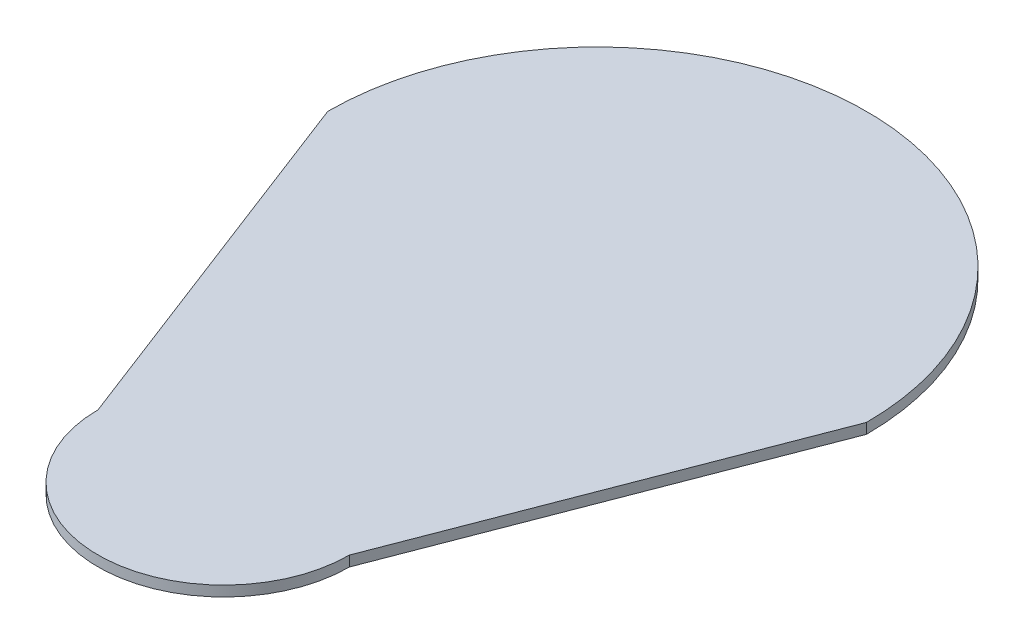
ISO-10303-21;
HEADER;
FILE_DESCRIPTION(('STEP AP214'),'2;1');
FILE_NAME('part.step','',(''),(''),'','','');
FILE_SCHEMA(('AUTOMOTIVE_DESIGN { 1 0 10303 214 1 1 1 1 }'));
ENDSEC;
DATA;
#1=APPLICATION_CONTEXT('core data for automotive mechanical design processes');
#2=APPLICATION_PROTOCOL_DEFINITION('international standard','automotive_design',2000,#1);
#3=PRODUCT_CONTEXT('',#1,'mechanical');
#4=PRODUCT('Part','Part','',(#3));
#5=PRODUCT_RELATED_PRODUCT_CATEGORY('part','',(#4));
#6=PRODUCT_DEFINITION_FORMATION('','',#4);
#7=PRODUCT_DEFINITION_CONTEXT('part definition',#1,'design');
#8=PRODUCT_DEFINITION('design','',#6,#7);
#9=PRODUCT_DEFINITION_SHAPE('','',#8);
#10=(LENGTH_UNIT() NAMED_UNIT(*) SI_UNIT(.MILLI.,.METRE.));
#11=(NAMED_UNIT(*) PLANE_ANGLE_UNIT() SI_UNIT($,.RADIAN.));
#12=(NAMED_UNIT(*) SI_UNIT($,.STERADIAN.) SOLID_ANGLE_UNIT());
#13=UNCERTAINTY_MEASURE_WITH_UNIT(LENGTH_MEASURE(1.E-05),#10,'distance_accuracy_value','');
#14=(GEOMETRIC_REPRESENTATION_CONTEXT(3) GLOBAL_UNCERTAINTY_ASSIGNED_CONTEXT((#13)) GLOBAL_UNIT_ASSIGNED_CONTEXT((#10,
#11,#12)) REPRESENTATION_CONTEXT('',''));
#15=CARTESIAN_POINT('',(0.,0.,0.));
#16=DIRECTION('',(0.,0.,1.));
#17=DIRECTION('',(1.,0.,0.));
#18=AXIS2_PLACEMENT_3D('',#15,#16,#17);
#19=CARTESIAN_POINT('',(0.,0.,0.));
#20=DIRECTION('',(0.,1.,0.));
#21=DIRECTION('',(0.,0.,1.));
#22=AXIS2_PLACEMENT_3D('',#19,#20,#21);
#23=PLANE('',#22);
#24=DIRECTION('',(0.359028119612366,0.,-0.933326743068904));
#25=VECTOR('',#24,1.);
#26=CARTESIAN_POINT('',(113.242845212589,0.,43.5617709212351));
#27=LINE('',#26,#25);
#28=CARTESIAN_POINT('',(60.6901829157269,0.,180.177268320401));
#29=VERTEX_POINT('',#28);
#30=CARTESIAN_POINT('',(130.,0.,0.));
#31=VERTEX_POINT('',#30);
#32=EDGE_CURVE('E113',#29,#31,#27,.T.);
#33=ORIENTED_EDGE('',*,*,#32,.F.);
#34=CARTESIAN_POINT('',(0.,0.,180.177268320401));
#35=DIRECTION('',(0.,1.,0.));
#36=DIRECTION('',(0.,0.,1.));
#37=AXIS2_PLACEMENT_3D('',#34,#35,#36);
#38=CIRCLE('',#37,60.6901829157268);
#39=CARTESIAN_POINT('',(-60.6901829157269,0.,180.177268320401));
#40=VERTEX_POINT('',#39);
#41=EDGE_CURVE('E125',#40,#29,#38,.T.);
#42=ORIENTED_EDGE('',*,*,#41,.F.);
#43=DIRECTION('',(-0.359028119612366,0.,-0.933326743068904));
#44=VECTOR('',#43,1.);
#45=CARTESIAN_POINT('',(-113.242845212589,0.,43.5617709212351));
#46=LINE('',#45,#44);
#47=CARTESIAN_POINT('',(-130.,0.,0.));
#48=VERTEX_POINT('',#47);
#49=EDGE_CURVE('E133',#40,#48,#46,.T.);
#50=ORIENTED_EDGE('',*,*,#49,.T.);
#51=CARTESIAN_POINT('',(0.,0.,0.));
#52=DIRECTION('',(0.,1.,0.));
#53=DIRECTION('',(0.,0.,1.));
#54=AXIS2_PLACEMENT_3D('',#51,#52,#53);
#55=CIRCLE('',#54,130.);
#56=EDGE_CURVE('E130',#31,#48,#55,.T.);
#57=ORIENTED_EDGE('',*,*,#56,.F.);
#58=EDGE_LOOP('',(#33,#42,#50,#57));
#59=FACE_BOUND('',#58,.T.);
#60=ADVANCED_FACE('F56',(#59),#23,.F.);
#61=CARTESIAN_POINT('',(0.,5.,180.177268320401));
#62=DIRECTION('',(0.,-1.,0.));
#63=DIRECTION('',(0.,0.,-1.));
#64=AXIS2_PLACEMENT_3D('',#61,#62,#63);
#65=CYLINDRICAL_SURFACE('',#64,60.6901829157268);
#66=ORIENTED_EDGE('',*,*,#41,.T.);
#67=DIRECTION('',(0.,-1.,0.));
#68=VECTOR('',#67,1.);
#69=CARTESIAN_POINT('',(60.6901829157269,5.,180.177268320401));
#70=LINE('',#69,#68);
#71=CARTESIAN_POINT('',(60.6901829157269,5.,180.177268320401));
#72=VERTEX_POINT('',#71);
#73=EDGE_CURVE('E12',#72,#29,#70,.T.);
#74=ORIENTED_EDGE('',*,*,#73,.F.);
#75=CARTESIAN_POINT('',(0.,5.,180.177268320401));
#76=DIRECTION('',(0.,1.,0.));
#77=DIRECTION('',(0.,0.,1.));
#78=AXIS2_PLACEMENT_3D('',#75,#76,#77);
#79=CIRCLE('',#78,60.6901829157268);
#80=CARTESIAN_POINT('',(-60.6901829157269,5.,180.177268320401));
#81=VERTEX_POINT('',#80);
#82=EDGE_CURVE('E106',#81,#72,#79,.T.);
#83=ORIENTED_EDGE('',*,*,#82,.F.);
#84=DIRECTION('',(0.,-1.,0.));
#85=VECTOR('',#84,1.);
#86=CARTESIAN_POINT('',(-60.6901829157269,5.,180.177268320401));
#87=LINE('',#86,#85);
#88=EDGE_CURVE('E74',#81,#40,#87,.T.);
#89=ORIENTED_EDGE('',*,*,#88,.T.);
#90=EDGE_LOOP('',(#66,#74,#83,#89));
#91=FACE_BOUND('',#90,.T.);
#92=ADVANCED_FACE('F58',(#91),#65,.T.);
#93=CARTESIAN_POINT('',(0.,5.,0.));
#94=DIRECTION('',(0.,1.,0.));
#95=DIRECTION('',(0.,0.,1.));
#96=AXIS2_PLACEMENT_3D('',#93,#94,#95);
#97=PLANE('',#96);
#98=ORIENTED_EDGE('',*,*,#82,.T.);
#99=DIRECTION('',(0.359028119612366,0.,-0.933326743068904));
#100=VECTOR('',#99,1.);
#101=CARTESIAN_POINT('',(113.242845212589,5.,43.5617709212351));
#102=LINE('',#101,#100);
#103=CARTESIAN_POINT('',(130.,5.,0.));
#104=VERTEX_POINT('',#103);
#105=EDGE_CURVE('E100',#72,#104,#102,.T.);
#106=ORIENTED_EDGE('',*,*,#105,.T.);
#107=CARTESIAN_POINT('',(0.,5.,0.));
#108=DIRECTION('',(0.,1.,0.));
#109=DIRECTION('',(0.,0.,1.));
#110=AXIS2_PLACEMENT_3D('',#107,#108,#109);
#111=CIRCLE('',#110,130.);
#112=CARTESIAN_POINT('',(-130.,5.,0.));
#113=VERTEX_POINT('',#112);
#114=EDGE_CURVE('E105',#104,#113,#111,.T.);
#115=ORIENTED_EDGE('',*,*,#114,.T.);
#116=DIRECTION('',(-0.359028119612366,0.,-0.933326743068904));
#117=VECTOR('',#116,1.);
#118=CARTESIAN_POINT('',(-113.242845212589,5.,43.5617709212351));
#119=LINE('',#118,#117);
#120=EDGE_CURVE('E119',#81,#113,#119,.T.);
#121=ORIENTED_EDGE('',*,*,#120,.F.);
#122=EDGE_LOOP('',(#98,#106,#115,#121));
#123=FACE_BOUND('',#122,.T.);
#124=ADVANCED_FACE('F102',(#123),#97,.T.);
#125=CARTESIAN_POINT('',(113.242845212589,5.,43.5617709212351));
#126=DIRECTION('',(-0.933326743068904,0.,-0.359028119612366));
#127=DIRECTION('',(-0.359028119612366,0.,0.933326743068904));
#128=AXIS2_PLACEMENT_3D('',#125,#126,#127);
#129=PLANE('',#128);
#130=ORIENTED_EDGE('',*,*,#32,.T.);
#131=DIRECTION('',(0.,-1.,0.));
#132=VECTOR('',#131,1.);
#133=CARTESIAN_POINT('',(130.,5.,0.));
#134=LINE('',#133,#132);
#135=EDGE_CURVE('E66',#104,#31,#134,.T.);
#136=ORIENTED_EDGE('',*,*,#135,.F.);
#137=ORIENTED_EDGE('',*,*,#105,.F.);
#138=ORIENTED_EDGE('',*,*,#73,.T.);
#139=EDGE_LOOP('',(#130,#136,#137,#138));
#140=FACE_BOUND('',#139,.T.);
#141=ADVANCED_FACE('F111',(#140),#129,.F.);
#142=CARTESIAN_POINT('',(0.,5.,0.));
#143=DIRECTION('',(0.,-1.,0.));
#144=DIRECTION('',(0.,0.,-1.));
#145=AXIS2_PLACEMENT_3D('',#142,#143,#144);
#146=CYLINDRICAL_SURFACE('',#145,130.);
#147=ORIENTED_EDGE('',*,*,#56,.T.);
#148=DIRECTION('',(0.,-1.,0.));
#149=VECTOR('',#148,1.);
#150=CARTESIAN_POINT('',(-130.,5.,0.));
#151=LINE('',#150,#149);
#152=EDGE_CURVE('E88',#113,#48,#151,.T.);
#153=ORIENTED_EDGE('',*,*,#152,.F.);
#154=ORIENTED_EDGE('',*,*,#114,.F.);
#155=ORIENTED_EDGE('',*,*,#135,.T.);
#156=EDGE_LOOP('',(#147,#153,#154,#155));
#157=FACE_BOUND('',#156,.T.);
#158=ADVANCED_FACE('F117',(#157),#146,.T.);
#159=CARTESIAN_POINT('',(-113.242845212589,5.,43.5617709212351));
#160=DIRECTION('',(-0.933326743068904,0.,0.359028119612366));
#161=DIRECTION('',(0.359028119612366,0.,0.933326743068904));
#162=AXIS2_PLACEMENT_3D('',#159,#160,#161);
#163=PLANE('',#162);
#164=ORIENTED_EDGE('',*,*,#49,.F.);
#165=ORIENTED_EDGE('',*,*,#88,.F.);
#166=ORIENTED_EDGE('',*,*,#120,.T.);
#167=ORIENTED_EDGE('',*,*,#152,.T.);
#168=EDGE_LOOP('',(#164,#165,#166,#167));
#169=FACE_BOUND('',#168,.T.);
#170=ADVANCED_FACE('F142',(#169),#163,.T.);
#171=CLOSED_SHELL('',(#60,#92,#124,#141,#158,#170));
#172=MANIFOLD_SOLID_BREP('B2',#171);
#173=ADVANCED_BREP_SHAPE_REPRESENTATION('',(#18,#172),#14);
#174=SHAPE_DEFINITION_REPRESENTATION(#9,#173);
ENDSEC;
END-ISO-10303-21;
